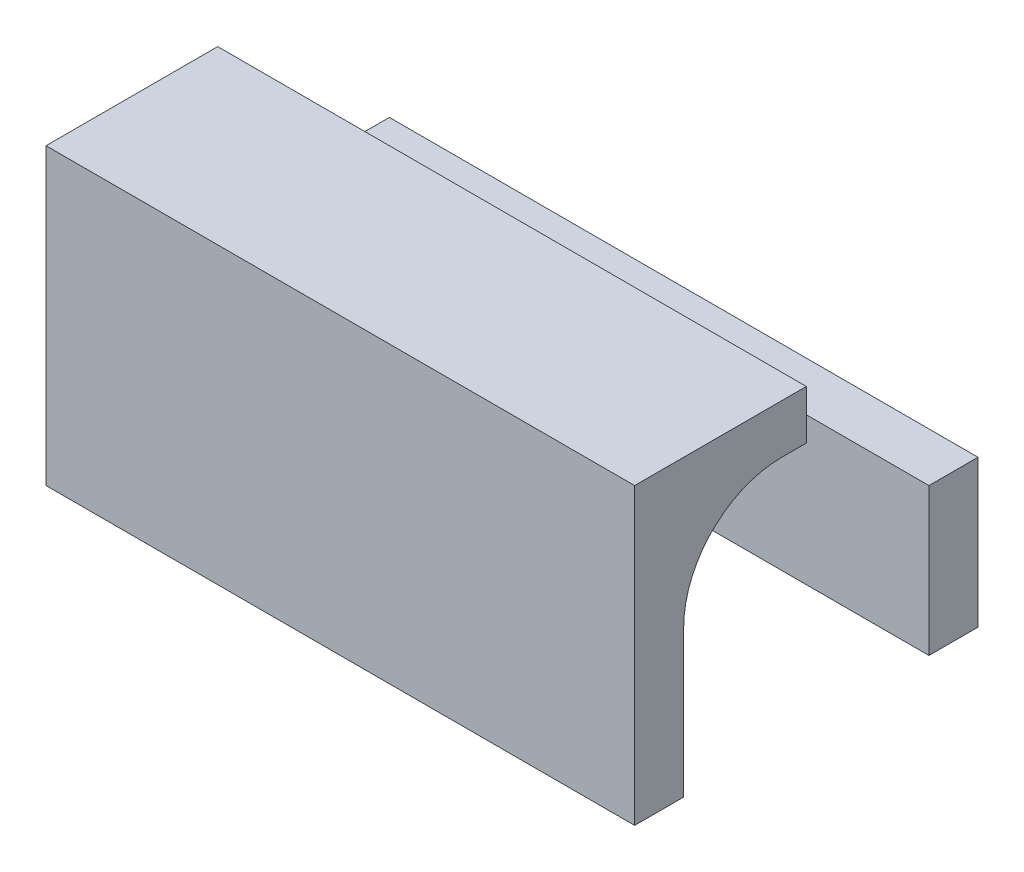
ISO-10303-21;
HEADER;
FILE_DESCRIPTION(('STEP AP214'),'2;1');
FILE_NAME('part.step','',(''),(''),'','','');
FILE_SCHEMA(('AUTOMOTIVE_DESIGN { 1 0 10303 214 1 1 1 1 }'));
ENDSEC;
DATA;
#1=APPLICATION_CONTEXT('core data for automotive mechanical design processes');
#2=APPLICATION_PROTOCOL_DEFINITION('international standard','automotive_design',2000,#1);
#3=PRODUCT_CONTEXT('',#1,'mechanical');
#4=PRODUCT('Part','Part','',(#3));
#5=PRODUCT_RELATED_PRODUCT_CATEGORY('part','',(#4));
#6=PRODUCT_DEFINITION_FORMATION('','',#4);
#7=PRODUCT_DEFINITION_CONTEXT('part definition',#1,'design');
#8=PRODUCT_DEFINITION('design','',#6,#7);
#9=PRODUCT_DEFINITION_SHAPE('','',#8);
#10=(LENGTH_UNIT() NAMED_UNIT(*) SI_UNIT(.MILLI.,.METRE.));
#11=(NAMED_UNIT(*) PLANE_ANGLE_UNIT() SI_UNIT($,.RADIAN.));
#12=(NAMED_UNIT(*) SI_UNIT($,.STERADIAN.) SOLID_ANGLE_UNIT());
#13=UNCERTAINTY_MEASURE_WITH_UNIT(LENGTH_MEASURE(1.E-05),#10,'distance_accuracy_value','');
#14=(GEOMETRIC_REPRESENTATION_CONTEXT(3) GLOBAL_UNCERTAINTY_ASSIGNED_CONTEXT((#13)) GLOBAL_UNIT_ASSIGNED_CONTEXT((#10,
#11,#12)) REPRESENTATION_CONTEXT('',''));
#15=CARTESIAN_POINT('',(0.,0.,0.));
#16=DIRECTION('',(0.,0.,1.));
#17=DIRECTION('',(1.,0.,0.));
#18=AXIS2_PLACEMENT_3D('',#15,#16,#17);
#19=CARTESIAN_POINT('',(12000.,0.,-6000.));
#20=DIRECTION('',(0.,0.,1.));
#21=DIRECTION('',(1.,0.,0.));
#22=AXIS2_PLACEMENT_3D('',#19,#20,#21);
#23=PLANE('',#22);
#24=DIRECTION('',(0.,1.,0.));
#25=VECTOR('',#24,1.);
#26=CARTESIAN_POINT('',(0.,0.,-6000.));
#27=LINE('',#26,#25);
#28=CARTESIAN_POINT('',(0.,0.,-6000.));
#29=VERTEX_POINT('',#28);
#30=CARTESIAN_POINT('',(0.,2999.99999999999,-6000.));
#31=VERTEX_POINT('',#30);
#32=EDGE_CURVE('E12',#29,#31,#27,.T.);
#33=ORIENTED_EDGE('',*,*,#32,.F.);
#34=DIRECTION('',(-1.,0.,0.));
#35=VECTOR('',#34,1.);
#36=CARTESIAN_POINT('',(12000.,0.,-6000.));
#37=LINE('',#36,#35);
#38=CARTESIAN_POINT('',(12000.,0.,-6000.));
#39=VERTEX_POINT('',#38);
#40=EDGE_CURVE('E102',#39,#29,#37,.T.);
#41=ORIENTED_EDGE('',*,*,#40,.F.);
#42=DIRECTION('',(0.,1.,0.));
#43=VECTOR('',#42,1.);
#44=CARTESIAN_POINT('',(12000.,0.,-6000.));
#45=LINE('',#44,#43);
#46=CARTESIAN_POINT('',(12000.,2999.99999999999,-6000.));
#47=VERTEX_POINT('',#46);
#48=EDGE_CURVE('E59',#39,#47,#45,.T.);
#49=ORIENTED_EDGE('',*,*,#48,.T.);
#50=DIRECTION('',(-1.,0.,0.));
#51=VECTOR('',#50,1.);
#52=CARTESIAN_POINT('',(12000.,2999.99999999999,-6000.));
#53=LINE('',#52,#51);
#54=EDGE_CURVE('E74',#47,#31,#53,.T.);
#55=ORIENTED_EDGE('',*,*,#54,.T.);
#56=EDGE_LOOP('',(#33,#41,#49,#55));
#57=FACE_BOUND('',#56,.T.);
#58=ADVANCED_FACE('F55',(#57),#23,.T.);
#59=CARTESIAN_POINT('',(12000.,0.,-6000.));
#60=DIRECTION('',(0.,1.,0.));
#61=DIRECTION('',(0.,0.,1.));
#62=AXIS2_PLACEMENT_3D('',#59,#60,#61);
#63=PLANE('',#62);
#64=DIRECTION('',(0.,0.,-1.));
#65=VECTOR('',#64,1.);
#66=CARTESIAN_POINT('',(0.,0.,-6000.));
#67=LINE('',#66,#65);
#68=CARTESIAN_POINT('',(0.,0.,-7000.));
#69=VERTEX_POINT('',#68);
#70=EDGE_CURVE('E105',#29,#69,#67,.T.);
#71=ORIENTED_EDGE('',*,*,#70,.T.);
#72=DIRECTION('',(-1.,0.,0.));
#73=VECTOR('',#72,1.);
#74=CARTESIAN_POINT('',(12000.,0.,-7000.));
#75=LINE('',#74,#73);
#76=CARTESIAN_POINT('',(12000.,0.,-7000.));
#77=VERTEX_POINT('',#76);
#78=EDGE_CURVE('E108',#77,#69,#75,.T.);
#79=ORIENTED_EDGE('',*,*,#78,.F.);
#80=DIRECTION('',(0.,0.,-1.));
#81=VECTOR('',#80,1.);
#82=CARTESIAN_POINT('',(12000.,0.,-6000.));
#83=LINE('',#82,#81);
#84=EDGE_CURVE('E124',#39,#77,#83,.T.);
#85=ORIENTED_EDGE('',*,*,#84,.F.);
#86=ORIENTED_EDGE('',*,*,#40,.T.);
#87=EDGE_LOOP('',(#71,#79,#85,#86));
#88=FACE_BOUND('',#87,.T.);
#89=ADVANCED_FACE('F107',(#88),#63,.F.);
#90=CARTESIAN_POINT('',(12000.,0.,-7000.));
#91=DIRECTION('',(0.,0.,1.));
#92=DIRECTION('',(0.,-1.,0.));
#93=AXIS2_PLACEMENT_3D('',#90,#91,#92);
#94=PLANE('',#93);
#95=DIRECTION('',(0.,1.,0.));
#96=VECTOR('',#95,1.);
#97=CARTESIAN_POINT('',(0.,0.,-7000.));
#98=LINE('',#97,#96);
#99=CARTESIAN_POINT('',(0.,3000.,-7000.));
#100=VERTEX_POINT('',#99);
#101=EDGE_CURVE('E111',#69,#100,#98,.T.);
#102=ORIENTED_EDGE('',*,*,#101,.T.);
#103=DIRECTION('',(-1.,0.,0.));
#104=VECTOR('',#103,1.);
#105=CARTESIAN_POINT('',(12000.,3000.,-7000.));
#106=LINE('',#105,#104);
#107=CARTESIAN_POINT('',(12000.,3000.,-7000.));
#108=VERTEX_POINT('',#107);
#109=EDGE_CURVE('E116',#108,#100,#106,.T.);
#110=ORIENTED_EDGE('',*,*,#109,.F.);
#111=DIRECTION('',(0.,1.,0.));
#112=VECTOR('',#111,1.);
#113=CARTESIAN_POINT('',(12000.,0.,-7000.));
#114=LINE('',#113,#112);
#115=EDGE_CURVE('E91',#77,#108,#114,.T.);
#116=ORIENTED_EDGE('',*,*,#115,.F.);
#117=ORIENTED_EDGE('',*,*,#78,.T.);
#118=EDGE_LOOP('',(#102,#110,#116,#117));
#119=FACE_BOUND('',#118,.T.);
#120=ADVANCED_FACE('F114',(#119),#94,.F.);
#121=CARTESIAN_POINT('',(12000.,3000.,-7000.));
#122=DIRECTION('',(0.,-1.,0.));
#123=DIRECTION('',(0.,0.,-1.));
#124=AXIS2_PLACEMENT_3D('',#121,#122,#123);
#125=PLANE('',#124);
#126=DIRECTION('',(0.,0.,1.));
#127=VECTOR('',#126,1.);
#128=CARTESIAN_POINT('',(0.,3000.,-7000.));
#129=LINE('',#128,#127);
#130=EDGE_CURVE('E65',#100,#31,#129,.T.);
#131=ORIENTED_EDGE('',*,*,#130,.T.);
#132=ORIENTED_EDGE('',*,*,#54,.F.);
#133=DIRECTION('',(0.,0.,1.));
#134=VECTOR('',#133,1.);
#135=CARTESIAN_POINT('',(12000.,3000.,-7000.));
#136=LINE('',#135,#134);
#137=EDGE_CURVE('E96',#108,#47,#136,.T.);
#138=ORIENTED_EDGE('',*,*,#137,.F.);
#139=ORIENTED_EDGE('',*,*,#109,.T.);
#140=EDGE_LOOP('',(#131,#132,#138,#139));
#141=FACE_BOUND('',#140,.T.);
#142=ADVANCED_FACE('F127',(#141),#125,.F.);
#143=CARTESIAN_POINT('',(12000.,0.,0.));
#144=DIRECTION('',(1.,0.,0.));
#145=DIRECTION('',(0.,0.,-1.));
#146=AXIS2_PLACEMENT_3D('',#143,#144,#145);
#147=PLANE('',#146);
#148=ORIENTED_EDGE('',*,*,#48,.F.);
#149=ORIENTED_EDGE('',*,*,#84,.T.);
#150=ORIENTED_EDGE('',*,*,#115,.T.);
#151=ORIENTED_EDGE('',*,*,#137,.T.);
#152=EDGE_LOOP('',(#148,#149,#150,#151));
#153=FACE_BOUND('',#152,.T.);
#154=ADVANCED_FACE('F57',(#153),#147,.T.);
#155=CARTESIAN_POINT('',(0.,0.,0.));
#156=DIRECTION('',(1.,0.,0.));
#157=DIRECTION('',(0.,0.,-1.));
#158=AXIS2_PLACEMENT_3D('',#155,#156,#157);
#159=PLANE('',#158);
#160=ORIENTED_EDGE('',*,*,#32,.T.);
#161=ORIENTED_EDGE('',*,*,#130,.F.);
#162=ORIENTED_EDGE('',*,*,#101,.F.);
#163=ORIENTED_EDGE('',*,*,#70,.F.);
#164=EDGE_LOOP('',(#160,#161,#162,#163));
#165=FACE_BOUND('',#164,.T.);
#166=ADVANCED_FACE('F119',(#165),#159,.F.);
#167=CLOSED_SHELL('',(#58,#89,#120,#142,#154,#166));
#168=MANIFOLD_SOLID_BREP('B2',#167);
#169=CARTESIAN_POINT('',(12000.,0.,0.));
#170=DIRECTION('',(0.,1.,0.));
#171=DIRECTION('',(0.,0.,1.));
#172=AXIS2_PLACEMENT_3D('',#169,#170,#171);
#173=PLANE('',#172);
#174=DIRECTION('',(0.,0.,-1.));
#175=VECTOR('',#174,1.);
#176=CARTESIAN_POINT('',(0.,0.,0.));
#177=LINE('',#176,#175);
#178=CARTESIAN_POINT('',(0.,0.,0.));
#179=VERTEX_POINT('',#178);
#180=CARTESIAN_POINT('',(0.,0.,-1000.));
#181=VERTEX_POINT('',#180);
#182=EDGE_CURVE('E276',#179,#181,#177,.T.);
#183=ORIENTED_EDGE('',*,*,#182,.T.);
#184=DIRECTION('',(-1.,0.,0.));
#185=VECTOR('',#184,1.);
#186=CARTESIAN_POINT('',(12000.,0.,-1000.));
#187=LINE('',#186,#185);
#188=CARTESIAN_POINT('',(12000.,0.,-1000.));
#189=VERTEX_POINT('',#188);
#190=EDGE_CURVE('E53',#189,#181,#187,.T.);
#191=ORIENTED_EDGE('',*,*,#190,.F.);
#192=DIRECTION('',(0.,0.,-1.));
#193=VECTOR('',#192,1.);
#194=CARTESIAN_POINT('',(12000.,0.,0.));
#195=LINE('',#194,#193);
#196=CARTESIAN_POINT('',(12000.,0.,0.));
#197=VERTEX_POINT('',#196);
#198=EDGE_CURVE('E299',#197,#189,#195,.T.);
#199=ORIENTED_EDGE('',*,*,#198,.F.);
#200=DIRECTION('',(-1.,0.,0.));
#201=VECTOR('',#200,1.);
#202=CARTESIAN_POINT('',(12000.,0.,0.));
#203=LINE('',#202,#201);
#204=EDGE_CURVE('E196',#197,#179,#203,.T.);
#205=ORIENTED_EDGE('',*,*,#204,.T.);
#206=EDGE_LOOP('',(#183,#191,#199,#205));
#207=FACE_BOUND('',#206,.T.);
#208=ADVANCED_FACE('F179',(#207),#173,.F.);
#209=CARTESIAN_POINT('',(12000.,0.,-1000.));
#210=DIRECTION('',(0.,0.,1.));
#211=DIRECTION('',(1.,0.,0.));
#212=AXIS2_PLACEMENT_3D('',#209,#210,#211);
#213=PLANE('',#212);
#214=DIRECTION('',(0.,1.,0.));
#215=VECTOR('',#214,1.);
#216=CARTESIAN_POINT('',(0.,0.,-1000.));
#217=LINE('',#216,#215);
#218=CARTESIAN_POINT('',(0.,2999.99999999999,-1000.));
#219=VERTEX_POINT('',#218);
#220=EDGE_CURVE('E279',#181,#219,#217,.T.);
#221=ORIENTED_EDGE('',*,*,#220,.T.);
#222=DIRECTION('',(-1.,0.,0.));
#223=VECTOR('',#222,1.);
#224=CARTESIAN_POINT('',(12000.,2999.99999999999,-1000.));
#225=LINE('',#224,#223);
#226=CARTESIAN_POINT('',(12000.,2999.99999999999,-1000.));
#227=VERTEX_POINT('',#226);
#228=EDGE_CURVE('E188',#227,#219,#225,.T.);
#229=ORIENTED_EDGE('',*,*,#228,.F.);
#230=DIRECTION('',(0.,1.,0.));
#231=VECTOR('',#230,1.);
#232=CARTESIAN_POINT('',(12000.,0.,-1000.));
#233=LINE('',#232,#231);
#234=EDGE_CURVE('E231',#189,#227,#233,.T.);
#235=ORIENTED_EDGE('',*,*,#234,.F.);
#236=ORIENTED_EDGE('',*,*,#190,.T.);
#237=EDGE_LOOP('',(#221,#229,#235,#236));
#238=FACE_BOUND('',#237,.T.);
#239=ADVANCED_FACE('F314',(#238),#213,.F.);
#240=CARTESIAN_POINT('',(12000.,3000.,-3000.));
#241=DIRECTION('',(-1.,0.,0.));
#242=DIRECTION('',(0.,0.,1.));
#243=AXIS2_PLACEMENT_3D('',#240,#241,#242);
#244=CYLINDRICAL_SURFACE('',#243,2000.);
#245=CARTESIAN_POINT('',(0.,3000.,-3000.));
#246=DIRECTION('',(1.,0.,0.));
#247=DIRECTION('',(0.,0.,-1.));
#248=AXIS2_PLACEMENT_3D('',#245,#246,#247);
#249=CIRCLE('',#248,2000.);
#250=CARTESIAN_POINT('',(0.,5000.,-3000.00000000001));
#251=VERTEX_POINT('',#250);
#252=EDGE_CURVE('E283',#251,#219,#249,.T.);
#253=ORIENTED_EDGE('',*,*,#252,.F.);
#254=DIRECTION('',(-1.,0.,0.));
#255=VECTOR('',#254,1.);
#256=CARTESIAN_POINT('',(12000.,5000.,-3000.00000000001));
#257=LINE('',#256,#255);
#258=CARTESIAN_POINT('',(12000.,5000.,-3000.00000000001));
#259=VERTEX_POINT('',#258);
#260=EDGE_CURVE('E306',#259,#251,#257,.T.);
#261=ORIENTED_EDGE('',*,*,#260,.F.);
#262=CARTESIAN_POINT('',(12000.,3000.,-3000.));
#263=DIRECTION('',(1.,0.,0.));
#264=DIRECTION('',(0.,0.,-1.));
#265=AXIS2_PLACEMENT_3D('',#262,#263,#264);
#266=CIRCLE('',#265,2000.);
#267=EDGE_CURVE('E313',#259,#227,#266,.T.);
#268=ORIENTED_EDGE('',*,*,#267,.T.);
#269=ORIENTED_EDGE('',*,*,#228,.T.);
#270=EDGE_LOOP('',(#253,#261,#268,#269));
#271=FACE_BOUND('',#270,.T.);
#272=ADVANCED_FACE('F312',(#271),#244,.F.);
#273=CARTESIAN_POINT('',(12000.,5000.,-3000.00000000001));
#274=DIRECTION('',(0.,1.,0.));
#275=DIRECTION('',(0.,0.,1.));
#276=AXIS2_PLACEMENT_3D('',#273,#274,#275);
#277=PLANE('',#276);
#278=DIRECTION('',(0.,0.,-1.));
#279=VECTOR('',#278,1.);
#280=CARTESIAN_POINT('',(0.,5000.,-3000.00000000001));
#281=LINE('',#280,#279);
#282=CARTESIAN_POINT('',(0.,5000.,-3500.));
#283=VERTEX_POINT('',#282);
#284=EDGE_CURVE('E287',#251,#283,#281,.T.);
#285=ORIENTED_EDGE('',*,*,#284,.T.);
#286=DIRECTION('',(-1.,0.,0.));
#287=VECTOR('',#286,1.);
#288=CARTESIAN_POINT('',(12000.,5000.,-3500.));
#289=LINE('',#288,#287);
#290=CARTESIAN_POINT('',(12000.,5000.,-3500.));
#291=VERTEX_POINT('',#290);
#292=EDGE_CURVE('E266',#291,#283,#289,.T.);
#293=ORIENTED_EDGE('',*,*,#292,.F.);
#294=DIRECTION('',(0.,0.,-1.));
#295=VECTOR('',#294,1.);
#296=CARTESIAN_POINT('',(12000.,5000.,-3000.00000000001));
#297=LINE('',#296,#295);
#298=EDGE_CURVE('E252',#259,#291,#297,.T.);
#299=ORIENTED_EDGE('',*,*,#298,.F.);
#300=ORIENTED_EDGE('',*,*,#260,.T.);
#301=EDGE_LOOP('',(#285,#293,#299,#300));
#302=FACE_BOUND('',#301,.T.);
#303=ADVANCED_FACE('F320',(#302),#277,.F.);
#304=CARTESIAN_POINT('',(12000.,5000.,-3500.));
#305=DIRECTION('',(0.,0.,1.));
#306=DIRECTION('',(0.,-1.,0.));
#307=AXIS2_PLACEMENT_3D('',#304,#305,#306);
#308=PLANE('',#307);
#309=DIRECTION('',(0.,1.,0.));
#310=VECTOR('',#309,1.);
#311=CARTESIAN_POINT('',(0.,5000.,-3500.));
#312=LINE('',#311,#310);
#313=CARTESIAN_POINT('',(0.,6000.,-3500.));
#314=VERTEX_POINT('',#313);
#315=EDGE_CURVE('E262',#283,#314,#312,.T.);
#316=ORIENTED_EDGE('',*,*,#315,.T.);
#317=DIRECTION('',(-1.,0.,0.));
#318=VECTOR('',#317,1.);
#319=CARTESIAN_POINT('',(12000.,6000.,-3500.));
#320=LINE('',#319,#318);
#321=CARTESIAN_POINT('',(12000.,6000.,-3500.));
#322=VERTEX_POINT('',#321);
#323=EDGE_CURVE('E259',#322,#314,#320,.T.);
#324=ORIENTED_EDGE('',*,*,#323,.F.);
#325=DIRECTION('',(0.,1.,0.));
#326=VECTOR('',#325,1.);
#327=CARTESIAN_POINT('',(12000.,5000.,-3500.));
#328=LINE('',#327,#326);
#329=EDGE_CURVE('E244',#291,#322,#328,.T.);
#330=ORIENTED_EDGE('',*,*,#329,.F.);
#331=ORIENTED_EDGE('',*,*,#292,.T.);
#332=EDGE_LOOP('',(#316,#324,#330,#331));
#333=FACE_BOUND('',#332,.T.);
#334=ADVANCED_FACE('F260',(#333),#308,.F.);
#335=CARTESIAN_POINT('',(12000.,6000.,1.77635683940025E-12));
#336=DIRECTION('',(0.,1.,0.));
#337=DIRECTION('',(0.,0.,1.));
#338=AXIS2_PLACEMENT_3D('',#335,#336,#337);
#339=PLANE('',#338);
#340=DIRECTION('',(0.,0.,-1.));
#341=VECTOR('',#340,1.);
#342=CARTESIAN_POINT('',(0.,6000.,1.77635683940025E-12));
#343=LINE('',#342,#341);
#344=CARTESIAN_POINT('',(0.,6000.,1.77635683940025E-12));
#345=VERTEX_POINT('',#344);
#346=EDGE_CURVE('E292',#345,#314,#343,.T.);
#347=ORIENTED_EDGE('',*,*,#346,.F.);
#348=DIRECTION('',(-1.,0.,0.));
#349=VECTOR('',#348,1.);
#350=CARTESIAN_POINT('',(12000.,6000.,1.77635683940025E-12));
#351=LINE('',#350,#349);
#352=CARTESIAN_POINT('',(12000.,6000.,1.77635683940025E-12));
#353=VERTEX_POINT('',#352);
#354=EDGE_CURVE('E219',#353,#345,#351,.T.);
#355=ORIENTED_EDGE('',*,*,#354,.F.);
#356=DIRECTION('',(0.,0.,-1.));
#357=VECTOR('',#356,1.);
#358=CARTESIAN_POINT('',(12000.,6000.,1.77635683940025E-12));
#359=LINE('',#358,#357);
#360=EDGE_CURVE('E249',#353,#322,#359,.T.);
#361=ORIENTED_EDGE('',*,*,#360,.T.);
#362=ORIENTED_EDGE('',*,*,#323,.T.);
#363=EDGE_LOOP('',(#347,#355,#361,#362));
#364=FACE_BOUND('',#363,.T.);
#365=ADVANCED_FACE('F268',(#364),#339,.T.);
#366=CARTESIAN_POINT('',(12000.,0.,0.));
#367=DIRECTION('',(0.,0.,1.));
#368=DIRECTION('',(0.,-1.,0.));
#369=AXIS2_PLACEMENT_3D('',#366,#367,#368);
#370=PLANE('',#369);
#371=DIRECTION('',(0.,1.,0.));
#372=VECTOR('',#371,1.);
#373=CARTESIAN_POINT('',(0.,0.,0.));
#374=LINE('',#373,#372);
#375=EDGE_CURVE('E295',#179,#345,#374,.T.);
#376=ORIENTED_EDGE('',*,*,#375,.F.);
#377=ORIENTED_EDGE('',*,*,#204,.F.);
#378=DIRECTION('',(0.,1.,0.));
#379=VECTOR('',#378,1.);
#380=CARTESIAN_POINT('',(12000.,0.,0.));
#381=LINE('',#380,#379);
#382=EDGE_CURVE('E270',#197,#353,#381,.T.);
#383=ORIENTED_EDGE('',*,*,#382,.T.);
#384=ORIENTED_EDGE('',*,*,#354,.T.);
#385=EDGE_LOOP('',(#376,#377,#383,#384));
#386=FACE_BOUND('',#385,.T.);
#387=ADVANCED_FACE('F328',(#386),#370,.T.);
#388=CARTESIAN_POINT('',(12000.,3000.,-3000.));
#389=DIRECTION('',(1.,0.,0.));
#390=DIRECTION('',(0.,0.,-1.));
#391=AXIS2_PLACEMENT_3D('',#388,#389,#390);
#392=PLANE('',#391);
#393=ORIENTED_EDGE('',*,*,#198,.T.);
#394=ORIENTED_EDGE('',*,*,#234,.T.);
#395=ORIENTED_EDGE('',*,*,#267,.F.);
#396=ORIENTED_EDGE('',*,*,#298,.T.);
#397=ORIENTED_EDGE('',*,*,#329,.T.);
#398=ORIENTED_EDGE('',*,*,#360,.F.);
#399=ORIENTED_EDGE('',*,*,#382,.F.);
#400=EDGE_LOOP('',(#393,#394,#395,#396,#397,#398,#399));
#401=FACE_BOUND('',#400,.T.);
#402=ADVANCED_FACE('F246',(#401),#392,.T.);
#403=CARTESIAN_POINT('',(0.,3000.,-3000.));
#404=DIRECTION('',(1.,0.,0.));
#405=DIRECTION('',(0.,0.,-1.));
#406=AXIS2_PLACEMENT_3D('',#403,#404,#405);
#407=PLANE('',#406);
#408=ORIENTED_EDGE('',*,*,#182,.F.);
#409=ORIENTED_EDGE('',*,*,#375,.T.);
#410=ORIENTED_EDGE('',*,*,#346,.T.);
#411=ORIENTED_EDGE('',*,*,#315,.F.);
#412=ORIENTED_EDGE('',*,*,#284,.F.);
#413=ORIENTED_EDGE('',*,*,#252,.T.);
#414=ORIENTED_EDGE('',*,*,#220,.F.);
#415=EDGE_LOOP('',(#408,#409,#410,#411,#412,#413,#414));
#416=FACE_BOUND('',#415,.T.);
#417=ADVANCED_FACE('F318',(#416),#407,.F.);
#418=CLOSED_SHELL('',(#208,#239,#272,#303,#334,#365,#387,#402,#417));
#419=MANIFOLD_SOLID_BREP('B6',#418);
#420=ADVANCED_BREP_SHAPE_REPRESENTATION('',(#18,#168,#419),#14);
#421=SHAPE_DEFINITION_REPRESENTATION(#9,#420);
ENDSEC;
END-ISO-10303-21;
